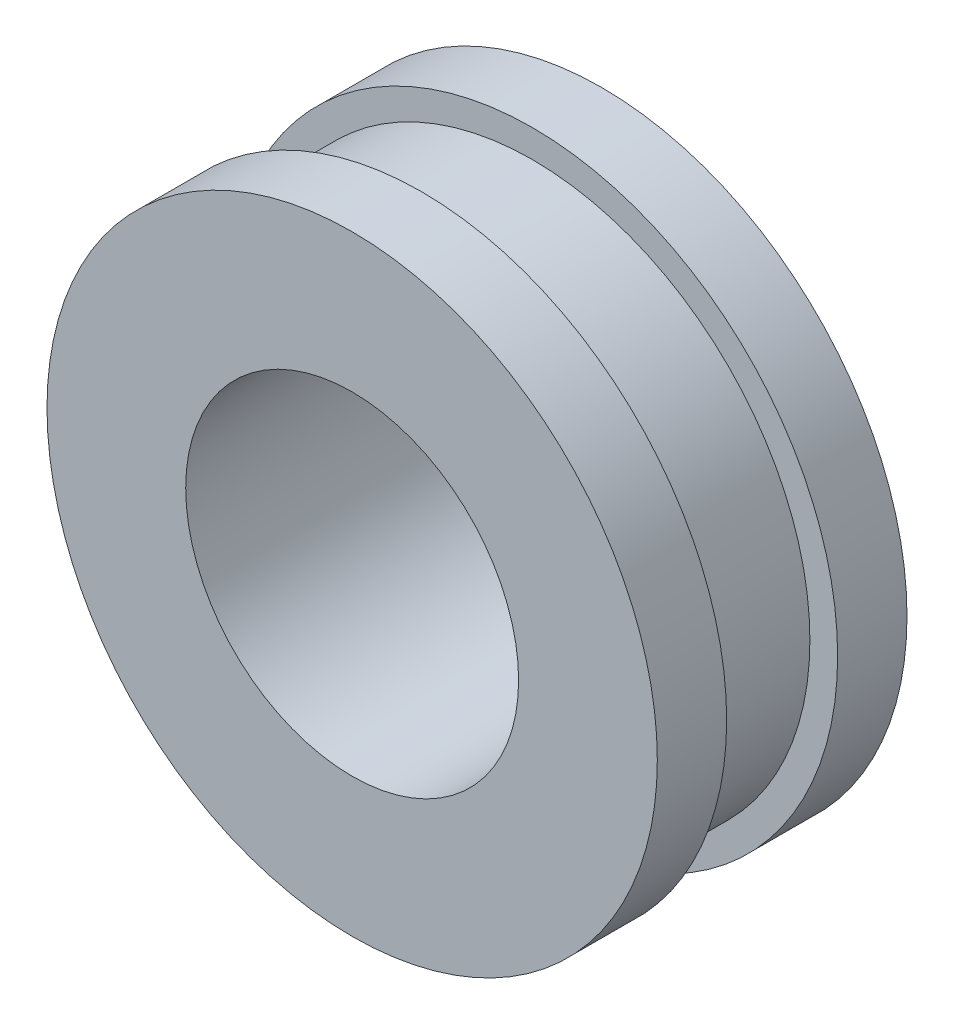
ISO-10303-21;
HEADER;
FILE_DESCRIPTION(('STEP AP214'),'2;1');
FILE_NAME('part.step','',(''),(''),'','','');
FILE_SCHEMA(('AUTOMOTIVE_DESIGN { 1 0 10303 214 1 1 1 1 }'));
ENDSEC;
DATA;
#1=APPLICATION_CONTEXT('core data for automotive mechanical design processes');
#2=APPLICATION_PROTOCOL_DEFINITION('international standard','automotive_design',2000,#1);
#3=PRODUCT_CONTEXT('',#1,'mechanical');
#4=PRODUCT('Part','Part','',(#3));
#5=PRODUCT_RELATED_PRODUCT_CATEGORY('part','',(#4));
#6=PRODUCT_DEFINITION_FORMATION('','',#4);
#7=PRODUCT_DEFINITION_CONTEXT('part definition',#1,'design');
#8=PRODUCT_DEFINITION('design','',#6,#7);
#9=PRODUCT_DEFINITION_SHAPE('','',#8);
#10=(LENGTH_UNIT() NAMED_UNIT(*) SI_UNIT(.MILLI.,.METRE.));
#11=(NAMED_UNIT(*) PLANE_ANGLE_UNIT() SI_UNIT($,.RADIAN.));
#12=(NAMED_UNIT(*) SI_UNIT($,.STERADIAN.) SOLID_ANGLE_UNIT());
#13=UNCERTAINTY_MEASURE_WITH_UNIT(LENGTH_MEASURE(1.E-05),#10,'distance_accuracy_value','');
#14=(GEOMETRIC_REPRESENTATION_CONTEXT(3) GLOBAL_UNCERTAINTY_ASSIGNED_CONTEXT((#13)) GLOBAL_UNIT_ASSIGNED_CONTEXT((#10,
#11,#12)) REPRESENTATION_CONTEXT('',''));
#15=CARTESIAN_POINT('',(0.,0.,0.));
#16=DIRECTION('',(0.,0.,1.));
#17=DIRECTION('',(1.,0.,0.));
#18=AXIS2_PLACEMENT_3D('',#15,#16,#17);
#19=CARTESIAN_POINT('',(0.,0.,2.25));
#20=DIRECTION('',(0.,0.,-1.));
#21=DIRECTION('',(-1.,0.,0.));
#22=AXIS2_PLACEMENT_3D('',#19,#20,#21);
#23=CYLINDRICAL_SURFACE('',#22,5.5);
#24=CARTESIAN_POINT('',(0.,0.,-2.25));
#25=DIRECTION('',(0.,0.,1.));
#26=DIRECTION('',(1.,0.,0.));
#27=AXIS2_PLACEMENT_3D('',#24,#25,#26);
#28=CIRCLE('',#27,5.5);
#29=CARTESIAN_POINT('',(5.5,0.,-2.25));
#30=VERTEX_POINT('',#29);
#31=EDGE_CURVE('E48',#30,#30,#28,.T.);
#32=ORIENTED_EDGE('',*,*,#31,.T.);
#33=EDGE_LOOP('',(#32));
#34=FACE_BOUND('',#33,.T.);
#35=CARTESIAN_POINT('',(0.,0.,-1.));
#36=DIRECTION('',(0.,0.,1.));
#37=DIRECTION('',(1.,0.,0.));
#38=AXIS2_PLACEMENT_3D('',#35,#36,#37);
#39=CIRCLE('',#38,5.5);
#40=CARTESIAN_POINT('',(5.5,0.,-1.));
#41=VERTEX_POINT('',#40);
#42=EDGE_CURVE('E42',#41,#41,#39,.T.);
#43=ORIENTED_EDGE('',*,*,#42,.F.);
#44=EDGE_LOOP('',(#43));
#45=FACE_BOUND('',#44,.T.);
#46=ADVANCED_FACE('F37',(#34,#45),#23,.T.);
#47=CARTESIAN_POINT('',(0.,0.,2.25));
#48=DIRECTION('',(0.,0.,1.));
#49=DIRECTION('',(1.,0.,0.));
#50=AXIS2_PLACEMENT_3D('',#47,#48,#49);
#51=PLANE('',#50);
#52=CARTESIAN_POINT('',(0.,0.,2.25));
#53=DIRECTION('',(0.,0.,1.));
#54=DIRECTION('',(1.,0.,0.));
#55=AXIS2_PLACEMENT_3D('',#52,#53,#54);
#56=CIRCLE('',#55,5.5);
#57=CARTESIAN_POINT('',(5.5,0.,2.25));
#58=VERTEX_POINT('',#57);
#59=EDGE_CURVE('E11',#58,#58,#56,.T.);
#60=ORIENTED_EDGE('',*,*,#59,.T.);
#61=EDGE_LOOP('',(#60));
#62=FACE_BOUND('',#61,.T.);
#63=CARTESIAN_POINT('',(0.,0.,2.25));
#64=DIRECTION('',(0.,0.,1.));
#65=DIRECTION('',(1.,0.,0.));
#66=AXIS2_PLACEMENT_3D('',#63,#64,#65);
#67=CIRCLE('',#66,3.);
#68=CARTESIAN_POINT('',(3.,0.,2.25));
#69=VERTEX_POINT('',#68);
#70=EDGE_CURVE('E52',#69,#69,#67,.T.);
#71=ORIENTED_EDGE('',*,*,#70,.F.);
#72=EDGE_LOOP('',(#71));
#73=FACE_BOUND('',#72,.T.);
#74=ADVANCED_FACE('F94',(#62,#73),#51,.T.);
#75=CARTESIAN_POINT('',(0.,0.,-2.25));
#76=DIRECTION('',(0.,0.,1.));
#77=DIRECTION('',(1.,0.,0.));
#78=AXIS2_PLACEMENT_3D('',#75,#76,#77);
#79=PLANE('',#78);
#80=ORIENTED_EDGE('',*,*,#31,.F.);
#81=EDGE_LOOP('',(#80));
#82=FACE_BOUND('',#81,.T.);
#83=CARTESIAN_POINT('',(0.,0.,-2.25));
#84=DIRECTION('',(0.,0.,1.));
#85=DIRECTION('',(1.,0.,0.));
#86=AXIS2_PLACEMENT_3D('',#83,#84,#85);
#87=CIRCLE('',#86,3.);
#88=CARTESIAN_POINT('',(3.,0.,-2.25));
#89=VERTEX_POINT('',#88);
#90=EDGE_CURVE('E57',#89,#89,#87,.T.);
#91=ORIENTED_EDGE('',*,*,#90,.T.);
#92=EDGE_LOOP('',(#91));
#93=FACE_BOUND('',#92,.T.);
#94=ADVANCED_FACE('F79',(#82,#93),#79,.F.);
#95=CARTESIAN_POINT('',(0.,0.,1.));
#96=DIRECTION('',(0.,0.,1.));
#97=DIRECTION('',(1.,0.,0.));
#98=AXIS2_PLACEMENT_3D('',#95,#96,#97);
#99=CIRCLE('',#98,5.5);
#100=CARTESIAN_POINT('',(5.5,0.,1.));
#101=VERTEX_POINT('',#100);
#102=EDGE_CURVE('E59',#101,#101,#99,.T.);
#103=ORIENTED_EDGE('',*,*,#102,.T.);
#104=EDGE_LOOP('',(#103));
#105=FACE_BOUND('',#104,.T.);
#106=ORIENTED_EDGE('',*,*,#59,.F.);
#107=EDGE_LOOP('',(#106));
#108=FACE_BOUND('',#107,.T.);
#109=ADVANCED_FACE('F45',(#105,#108),#23,.T.);
#110=CARTESIAN_POINT('',(0.,0.,2.25));
#111=DIRECTION('',(0.,0.,-1.));
#112=DIRECTION('',(-1.,0.,0.));
#113=AXIS2_PLACEMENT_3D('',#110,#111,#112);
#114=CYLINDRICAL_SURFACE('',#113,3.);
#115=ORIENTED_EDGE('',*,*,#70,.T.);
#116=EDGE_LOOP('',(#115));
#117=FACE_BOUND('',#116,.T.);
#118=ORIENTED_EDGE('',*,*,#90,.F.);
#119=EDGE_LOOP('',(#118));
#120=FACE_BOUND('',#119,.T.);
#121=ADVANCED_FACE('F80',(#117,#120),#114,.F.);
#122=CARTESIAN_POINT('',(0.,0.,-1.));
#123=DIRECTION('',(0.,0.,1.));
#124=DIRECTION('',(1.,0.,0.));
#125=AXIS2_PLACEMENT_3D('',#122,#123,#124);
#126=PLANE('',#125);
#127=CARTESIAN_POINT('',(0.,0.,-1.));
#128=DIRECTION('',(0.,0.,1.));
#129=DIRECTION('',(1.,0.,0.));
#130=AXIS2_PLACEMENT_3D('',#127,#128,#129);
#131=CIRCLE('',#130,5.);
#132=CARTESIAN_POINT('',(5.,0.,-1.));
#133=VERTEX_POINT('',#132);
#134=EDGE_CURVE('E58',#133,#133,#131,.T.);
#135=ORIENTED_EDGE('',*,*,#134,.F.);
#136=EDGE_LOOP('',(#135));
#137=FACE_BOUND('',#136,.T.);
#138=ORIENTED_EDGE('',*,*,#42,.T.);
#139=EDGE_LOOP('',(#138));
#140=FACE_BOUND('',#139,.T.);
#141=ADVANCED_FACE('F81',(#137,#140),#126,.T.);
#142=CARTESIAN_POINT('',(0.,0.,1.));
#143=DIRECTION('',(0.,0.,1.));
#144=DIRECTION('',(1.,0.,0.));
#145=AXIS2_PLACEMENT_3D('',#142,#143,#144);
#146=PLANE('',#145);
#147=CARTESIAN_POINT('',(0.,0.,1.));
#148=DIRECTION('',(0.,0.,1.));
#149=DIRECTION('',(1.,0.,0.));
#150=AXIS2_PLACEMENT_3D('',#147,#148,#149);
#151=CIRCLE('',#150,5.);
#152=CARTESIAN_POINT('',(5.,0.,1.));
#153=VERTEX_POINT('',#152);
#154=EDGE_CURVE('E61',#153,#153,#151,.T.);
#155=ORIENTED_EDGE('',*,*,#154,.T.);
#156=EDGE_LOOP('',(#155));
#157=FACE_BOUND('',#156,.T.);
#158=ORIENTED_EDGE('',*,*,#102,.F.);
#159=EDGE_LOOP('',(#158));
#160=FACE_BOUND('',#159,.T.);
#161=ADVANCED_FACE('F86',(#157,#160),#146,.F.);
#162=CARTESIAN_POINT('',(0.,0.,-1.));
#163=DIRECTION('',(0.,0.,1.));
#164=DIRECTION('',(1.,0.,0.));
#165=AXIS2_PLACEMENT_3D('',#162,#163,#164);
#166=CYLINDRICAL_SURFACE('',#165,5.);
#167=ORIENTED_EDGE('',*,*,#134,.T.);
#168=EDGE_LOOP('',(#167));
#169=FACE_BOUND('',#168,.T.);
#170=ORIENTED_EDGE('',*,*,#154,.F.);
#171=EDGE_LOOP('',(#170));
#172=FACE_BOUND('',#171,.T.);
#173=ADVANCED_FACE('F138',(#169,#172),#166,.T.);
#174=CLOSED_SHELL('',(#46,#74,#94,#109,#121,#141,#161,#173));
#175=MANIFOLD_SOLID_BREP('B2',#174);
#176=ADVANCED_BREP_SHAPE_REPRESENTATION('',(#18,#175),#14);
#177=SHAPE_DEFINITION_REPRESENTATION(#9,#176);
ENDSEC;
END-ISO-10303-21;
